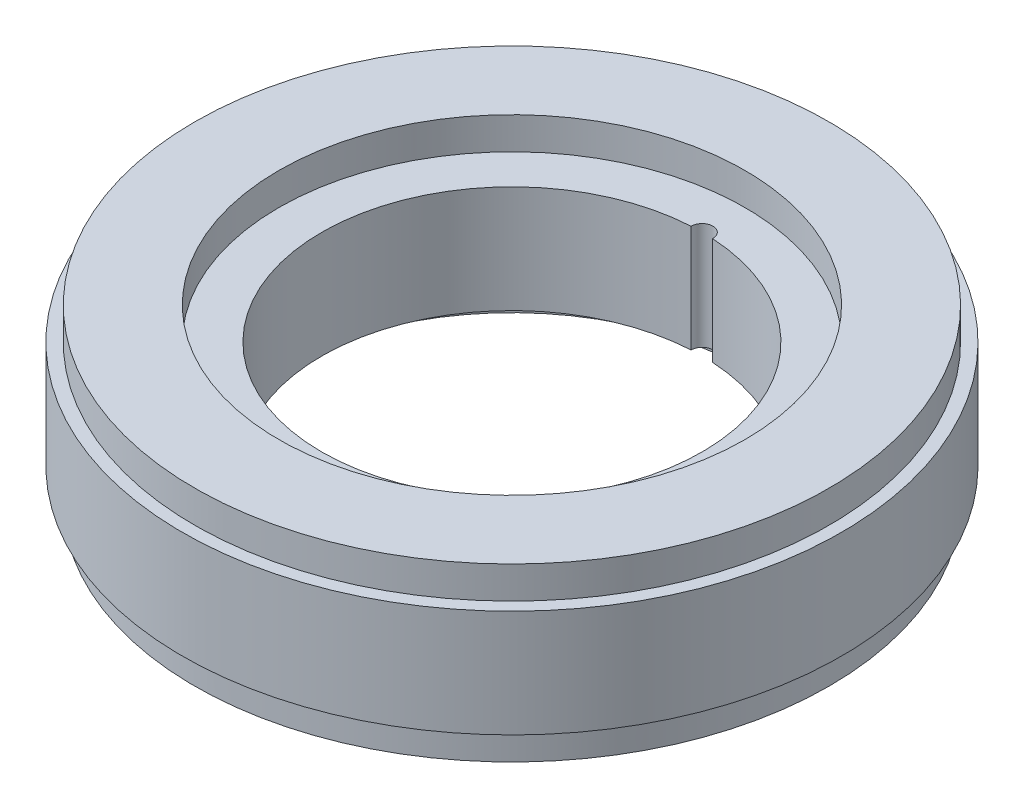
ISO-10303-21;
HEADER;
FILE_DESCRIPTION(('STEP AP214'),'2;1');
FILE_NAME('part.step','',(''),(''),'','','');
FILE_SCHEMA(('AUTOMOTIVE_DESIGN { 1 0 10303 214 1 1 1 1 }'));
ENDSEC;
DATA;
#1=APPLICATION_CONTEXT('core data for automotive mechanical design processes');
#2=APPLICATION_PROTOCOL_DEFINITION('international standard','automotive_design',2000,#1);
#3=PRODUCT_CONTEXT('',#1,'mechanical');
#4=PRODUCT('Part','Part','',(#3));
#5=PRODUCT_RELATED_PRODUCT_CATEGORY('part','',(#4));
#6=PRODUCT_DEFINITION_FORMATION('','',#4);
#7=PRODUCT_DEFINITION_CONTEXT('part definition',#1,'design');
#8=PRODUCT_DEFINITION('design','',#6,#7);
#9=PRODUCT_DEFINITION_SHAPE('','',#8);
#10=(LENGTH_UNIT() NAMED_UNIT(*) SI_UNIT(.MILLI.,.METRE.));
#11=(NAMED_UNIT(*) PLANE_ANGLE_UNIT() SI_UNIT($,.RADIAN.));
#12=(NAMED_UNIT(*) SI_UNIT($,.STERADIAN.) SOLID_ANGLE_UNIT());
#13=UNCERTAINTY_MEASURE_WITH_UNIT(LENGTH_MEASURE(1.E-05),#10,'distance_accuracy_value','');
#14=(GEOMETRIC_REPRESENTATION_CONTEXT(3) GLOBAL_UNCERTAINTY_ASSIGNED_CONTEXT((#13)) GLOBAL_UNIT_ASSIGNED_CONTEXT((#10,
#11,#12)) REPRESENTATION_CONTEXT('',''));
#15=CARTESIAN_POINT('',(0.,0.,0.));
#16=DIRECTION('',(0.,0.,1.));
#17=DIRECTION('',(1.,0.,0.));
#18=AXIS2_PLACEMENT_3D('',#15,#16,#17);
#19=CARTESIAN_POINT('',(0.,0.,-17.75));
#20=DIRECTION('',(0.,-1.,0.));
#21=DIRECTION('',(1.,0.,0.));
#22=AXIS2_PLACEMENT_3D('',#19,#20,#21);
#23=CYLINDRICAL_SURFACE('',#22,1.);
#24=DIRECTION('',(0.,-1.,0.));
#25=VECTOR('',#24,1.);
#26=CARTESIAN_POINT('',(0.9996031745875,10.,-17.72183098592));
#27=LINE('',#26,#25);
#28=CARTESIAN_POINT('',(0.9996031745876,10.,-17.72183098592));
#29=VERTEX_POINT('',#28);
#30=CARTESIAN_POINT('',(0.9996031745876,0.,-17.72183098592));
#31=VERTEX_POINT('',#30);
#32=EDGE_CURVE('E62',#29,#31,#27,.T.);
#33=ORIENTED_EDGE('',*,*,#32,.F.);
#34=CARTESIAN_POINT('',(0.,10.,-17.75));
#35=DIRECTION('',(0.,1.,0.));
#36=DIRECTION('',(-1.,0.,0.));
#37=AXIS2_PLACEMENT_3D('',#34,#35,#36);
#38=CIRCLE('',#37,1.);
#39=CARTESIAN_POINT('',(-0.9996031745876,10.,-17.72183098592));
#40=VERTEX_POINT('',#39);
#41=EDGE_CURVE('E52',#29,#40,#38,.T.);
#42=ORIENTED_EDGE('',*,*,#41,.T.);
#43=DIRECTION('',(0.,-1.,0.));
#44=VECTOR('',#43,1.);
#45=CARTESIAN_POINT('',(-0.9996031745875,10.,-17.72183098592));
#46=LINE('',#45,#44);
#47=CARTESIAN_POINT('',(-0.9996031745876,0.,-17.72183098592));
#48=VERTEX_POINT('',#47);
#49=EDGE_CURVE('E66',#40,#48,#46,.T.);
#50=ORIENTED_EDGE('',*,*,#49,.T.);
#51=CARTESIAN_POINT('',(0.,0.,-17.75));
#52=DIRECTION('',(0.,-1.,0.));
#53=DIRECTION('',(1.,0.,0.));
#54=AXIS2_PLACEMENT_3D('',#51,#52,#53);
#55=CIRCLE('',#54,1.);
#56=EDGE_CURVE('E20',#48,#31,#55,.T.);
#57=ORIENTED_EDGE('',*,*,#56,.T.);
#58=EDGE_LOOP('',(#33,#42,#50,#57));
#59=FACE_BOUND('',#58,.T.);
#60=ADVANCED_FACE('F17',(#59),#23,.F.);
#61=CARTESIAN_POINT('',(0.,0.,0.));
#62=DIRECTION('',(0.,-1.,0.));
#63=DIRECTION('',(1.,0.,0.));
#64=AXIS2_PLACEMENT_3D('',#61,#62,#63);
#65=CYLINDRICAL_SURFACE('',#64,29.6);
#66=CARTESIAN_POINT('',(0.,-3.,0.));
#67=DIRECTION('',(0.,1.,0.));
#68=DIRECTION('',(1.,0.,0.));
#69=AXIS2_PLACEMENT_3D('',#66,#67,#68);
#70=CIRCLE('',#69,29.6);
#71=CARTESIAN_POINT('',(29.6,-3.,0.));
#72=VERTEX_POINT('',#71);
#73=EDGE_CURVE('E11',#72,#72,#70,.T.);
#74=ORIENTED_EDGE('',*,*,#73,.T.);
#75=EDGE_LOOP('',(#74));
#76=FACE_BOUND('',#75,.T.);
#77=CARTESIAN_POINT('',(0.,0.,0.));
#78=DIRECTION('',(0.,-1.,0.));
#79=DIRECTION('',(-1.,0.,0.));
#80=AXIS2_PLACEMENT_3D('',#77,#78,#79);
#81=CIRCLE('',#80,29.6);
#82=CARTESIAN_POINT('',(-29.6,0.,0.));
#83=VERTEX_POINT('',#82);
#84=EDGE_CURVE('E113',#83,#83,#81,.T.);
#85=ORIENTED_EDGE('',*,*,#84,.T.);
#86=EDGE_LOOP('',(#85));
#87=FACE_BOUND('',#86,.T.);
#88=ADVANCED_FACE('F143',(#76,#87),#65,.T.);
#89=CARTESIAN_POINT('',(0.,-3.,0.));
#90=DIRECTION('',(0.,-1.,0.));
#91=DIRECTION('',(0.,0.,-1.));
#92=AXIS2_PLACEMENT_3D('',#89,#90,#91);
#93=PLANE('',#92);
#94=CARTESIAN_POINT('',(0.,-3.,0.));
#95=DIRECTION('',(0.,-1.,0.));
#96=DIRECTION('',(-1.,0.,1.183886126291E-13));
#97=AXIS2_PLACEMENT_3D('',#94,#95,#96);
#98=CIRCLE('',#97,21.75);
#99=CARTESIAN_POINT('',(-21.75,-3.,2.57495232468292E-12));
#100=VERTEX_POINT('',#99);
#101=EDGE_CURVE('E27',#100,#100,#98,.T.);
#102=ORIENTED_EDGE('',*,*,#101,.F.);
#103=EDGE_LOOP('',(#102));
#104=FACE_BOUND('',#103,.T.);
#105=ORIENTED_EDGE('',*,*,#73,.F.);
#106=EDGE_LOOP('',(#105));
#107=FACE_BOUND('',#106,.T.);
#108=ADVANCED_FACE('F147',(#104,#107),#93,.T.);
#109=CARTESIAN_POINT('',(0.,0.,0.));
#110=DIRECTION('',(0.,-1.,0.));
#111=DIRECTION('',(1.,0.,0.));
#112=AXIS2_PLACEMENT_3D('',#109,#110,#111);
#113=CYLINDRICAL_SURFACE('',#112,21.75);
#114=ORIENTED_EDGE('',*,*,#101,.T.);
#115=EDGE_LOOP('',(#114));
#116=FACE_BOUND('',#115,.T.);
#117=CARTESIAN_POINT('',(0.,0.,0.));
#118=DIRECTION('',(0.,1.,0.));
#119=DIRECTION('',(-1.,0.,0.));
#120=AXIS2_PLACEMENT_3D('',#117,#118,#119);
#121=CIRCLE('',#120,21.75);
#122=CARTESIAN_POINT('',(-21.75,0.,0.));
#123=VERTEX_POINT('',#122);
#124=EDGE_CURVE('E79',#123,#123,#121,.T.);
#125=ORIENTED_EDGE('',*,*,#124,.T.);
#126=EDGE_LOOP('',(#125));
#127=FACE_BOUND('',#126,.T.);
#128=ADVANCED_FACE('F152',(#116,#127),#113,.F.);
#129=CARTESIAN_POINT('',(0.,0.,0.));
#130=DIRECTION('',(0.,1.,0.));
#131=DIRECTION('',(1.,0.,0.));
#132=AXIS2_PLACEMENT_3D('',#129,#130,#131);
#133=PLANE('',#132);
#134=ORIENTED_EDGE('',*,*,#56,.F.);
#135=CARTESIAN_POINT('',(0.,0.,0.));
#136=DIRECTION('',(0.,-1.,0.));
#137=DIRECTION('',(0.0563156718077508,0.,-0.998413013291014));
#138=AXIS2_PLACEMENT_3D('',#135,#136,#137);
#139=CIRCLE('',#138,17.75);
#140=EDGE_CURVE('E65',#31,#48,#139,.T.);
#141=ORIENTED_EDGE('',*,*,#140,.F.);
#142=EDGE_LOOP('',(#134,#141));
#143=FACE_BOUND('',#142,.T.);
#144=ORIENTED_EDGE('',*,*,#124,.F.);
#145=EDGE_LOOP('',(#144));
#146=FACE_BOUND('',#145,.T.);
#147=ADVANCED_FACE('F157',(#143,#146),#133,.F.);
#148=CARTESIAN_POINT('',(0.,0.,0.));
#149=DIRECTION('',(0.,-1.,0.));
#150=DIRECTION('',(1.,0.,0.));
#151=AXIS2_PLACEMENT_3D('',#148,#149,#150);
#152=CYLINDRICAL_SURFACE('',#151,17.75);
#153=ORIENTED_EDGE('',*,*,#49,.F.);
#154=CARTESIAN_POINT('',(0.,10.,0.));
#155=DIRECTION('',(0.,1.,0.));
#156=DIRECTION('',(1.,0.,0.));
#157=AXIS2_PLACEMENT_3D('',#154,#155,#156);
#158=CIRCLE('',#157,17.75);
#159=EDGE_CURVE('E56',#40,#29,#158,.T.);
#160=ORIENTED_EDGE('',*,*,#159,.T.);
#161=ORIENTED_EDGE('',*,*,#32,.T.);
#162=ORIENTED_EDGE('',*,*,#140,.T.);
#163=EDGE_LOOP('',(#153,#160,#161,#162));
#164=FACE_BOUND('',#163,.T.);
#165=ADVANCED_FACE('F68',(#164),#152,.F.);
#166=CARTESIAN_POINT('',(0.,10.,0.));
#167=DIRECTION('',(0.,1.,0.));
#168=DIRECTION('',(1.,0.,0.));
#169=AXIS2_PLACEMENT_3D('',#166,#167,#168);
#170=PLANE('',#169);
#171=ORIENTED_EDGE('',*,*,#41,.F.);
#172=ORIENTED_EDGE('',*,*,#159,.F.);
#173=EDGE_LOOP('',(#171,#172));
#174=FACE_BOUND('',#173,.T.);
#175=CARTESIAN_POINT('',(0.,10.,0.));
#176=DIRECTION('',(0.,-1.,0.));
#177=DIRECTION('',(-1.,0.,0.));
#178=AXIS2_PLACEMENT_3D('',#175,#176,#177);
#179=CIRCLE('',#178,21.75);
#180=CARTESIAN_POINT('',(-21.75,10.,0.));
#181=VERTEX_POINT('',#180);
#182=EDGE_CURVE('E59',#181,#181,#179,.T.);
#183=ORIENTED_EDGE('',*,*,#182,.F.);
#184=EDGE_LOOP('',(#183));
#185=FACE_BOUND('',#184,.T.);
#186=ADVANCED_FACE('F53',(#174,#185),#170,.T.);
#187=CARTESIAN_POINT('',(0.,10.,0.));
#188=DIRECTION('',(0.,1.,0.));
#189=DIRECTION('',(1.,0.,0.));
#190=AXIS2_PLACEMENT_3D('',#187,#188,#189);
#191=CYLINDRICAL_SURFACE('',#190,21.75);
#192=ORIENTED_EDGE('',*,*,#182,.T.);
#193=EDGE_LOOP('',(#192));
#194=FACE_BOUND('',#193,.T.);
#195=CARTESIAN_POINT('',(0.,13.,0.));
#196=DIRECTION('',(0.,1.,0.));
#197=DIRECTION('',(-1.,0.,1.174005936248E-13));
#198=AXIS2_PLACEMENT_3D('',#195,#196,#197);
#199=CIRCLE('',#198,21.75);
#200=CARTESIAN_POINT('',(-21.75,13.,2.5534629113394E-12));
#201=VERTEX_POINT('',#200);
#202=EDGE_CURVE('E100',#201,#201,#199,.T.);
#203=ORIENTED_EDGE('',*,*,#202,.T.);
#204=EDGE_LOOP('',(#203));
#205=FACE_BOUND('',#204,.T.);
#206=ADVANCED_FACE('F163',(#194,#205),#191,.F.);
#207=CARTESIAN_POINT('',(0.,13.,0.));
#208=DIRECTION('',(0.,1.,0.));
#209=DIRECTION('',(1.,0.,0.));
#210=AXIS2_PLACEMENT_3D('',#207,#208,#209);
#211=PLANE('',#210);
#212=ORIENTED_EDGE('',*,*,#202,.F.);
#213=EDGE_LOOP('',(#212));
#214=FACE_BOUND('',#213,.T.);
#215=CARTESIAN_POINT('',(0.,13.,0.));
#216=DIRECTION('',(0.,-1.,0.));
#217=DIRECTION('',(-1.,0.,0.));
#218=AXIS2_PLACEMENT_3D('',#215,#216,#217);
#219=CIRCLE('',#218,29.6);
#220=CARTESIAN_POINT('',(-29.6,13.,-1.11256968356758E-12));
#221=VERTEX_POINT('',#220);
#222=EDGE_CURVE('E101',#221,#221,#219,.T.);
#223=ORIENTED_EDGE('',*,*,#222,.F.);
#224=EDGE_LOOP('',(#223));
#225=FACE_BOUND('',#224,.T.);
#226=ADVANCED_FACE('F166',(#214,#225),#211,.T.);
#227=CARTESIAN_POINT('',(0.,10.,0.));
#228=DIRECTION('',(0.,1.,0.));
#229=DIRECTION('',(1.,0.,0.));
#230=AXIS2_PLACEMENT_3D('',#227,#228,#229);
#231=CYLINDRICAL_SURFACE('',#230,29.6);
#232=ORIENTED_EDGE('',*,*,#222,.T.);
#233=EDGE_LOOP('',(#232));
#234=FACE_BOUND('',#233,.T.);
#235=CARTESIAN_POINT('',(0.,10.,0.));
#236=DIRECTION('',(0.,1.,0.));
#237=DIRECTION('',(-1.,0.,0.));
#238=AXIS2_PLACEMENT_3D('',#235,#236,#237);
#239=CIRCLE('',#238,29.6);
#240=CARTESIAN_POINT('',(-29.6,10.,0.));
#241=VERTEX_POINT('',#240);
#242=EDGE_CURVE('E104',#241,#241,#239,.T.);
#243=ORIENTED_EDGE('',*,*,#242,.T.);
#244=EDGE_LOOP('',(#243));
#245=FACE_BOUND('',#244,.T.);
#246=ADVANCED_FACE('F170',(#234,#245),#231,.T.);
#247=CARTESIAN_POINT('',(0.,10.,0.));
#248=DIRECTION('',(0.,1.,0.));
#249=DIRECTION('',(1.,0.,0.));
#250=AXIS2_PLACEMENT_3D('',#247,#248,#249);
#251=PLANE('',#250);
#252=ORIENTED_EDGE('',*,*,#242,.F.);
#253=EDGE_LOOP('',(#252));
#254=FACE_BOUND('',#253,.T.);
#255=CARTESIAN_POINT('',(0.,10.,0.));
#256=DIRECTION('',(0.,-1.,0.));
#257=DIRECTION('',(-1.,0.,0.));
#258=AXIS2_PLACEMENT_3D('',#255,#256,#257);
#259=CIRCLE('',#258,30.75);
#260=CARTESIAN_POINT('',(-30.75,10.,0.));
#261=VERTEX_POINT('',#260);
#262=EDGE_CURVE('E109',#261,#261,#259,.T.);
#263=ORIENTED_EDGE('',*,*,#262,.F.);
#264=EDGE_LOOP('',(#263));
#265=FACE_BOUND('',#264,.T.);
#266=ADVANCED_FACE('F137',(#254,#265),#251,.T.);
#267=CARTESIAN_POINT('',(0.,0.,0.));
#268=DIRECTION('',(0.,1.,0.));
#269=DIRECTION('',(1.,0.,0.));
#270=AXIS2_PLACEMENT_3D('',#267,#268,#269);
#271=CYLINDRICAL_SURFACE('',#270,30.75);
#272=ORIENTED_EDGE('',*,*,#262,.T.);
#273=EDGE_LOOP('',(#272));
#274=FACE_BOUND('',#273,.T.);
#275=CARTESIAN_POINT('',(0.,0.,0.));
#276=DIRECTION('',(0.,1.,0.));
#277=DIRECTION('',(-1.,0.,0.));
#278=AXIS2_PLACEMENT_3D('',#275,#276,#277);
#279=CIRCLE('',#278,30.75);
#280=CARTESIAN_POINT('',(-30.75,0.,0.));
#281=VERTEX_POINT('',#280);
#282=EDGE_CURVE('E117',#281,#281,#279,.T.);
#283=ORIENTED_EDGE('',*,*,#282,.T.);
#284=EDGE_LOOP('',(#283));
#285=FACE_BOUND('',#284,.T.);
#286=ADVANCED_FACE('F127',(#274,#285),#271,.T.);
#287=CARTESIAN_POINT('',(0.,0.,0.));
#288=DIRECTION('',(0.,1.,0.));
#289=DIRECTION('',(1.,0.,0.));
#290=AXIS2_PLACEMENT_3D('',#287,#288,#289);
#291=PLANE('',#290);
#292=ORIENTED_EDGE('',*,*,#84,.F.);
#293=EDGE_LOOP('',(#292));
#294=FACE_BOUND('',#293,.T.);
#295=ORIENTED_EDGE('',*,*,#282,.F.);
#296=EDGE_LOOP('',(#295));
#297=FACE_BOUND('',#296,.T.);
#298=ADVANCED_FACE('F129',(#294,#297),#291,.F.);
#299=CLOSED_SHELL('',(#60,#88,#108,#128,#147,#165,#186,#206,#226,#246,#266,#286,#298));
#300=MANIFOLD_SOLID_BREP('B1',#299);
#301=ADVANCED_BREP_SHAPE_REPRESENTATION('',(#18,#300),#14);
#302=SHAPE_DEFINITION_REPRESENTATION(#9,#301);
ENDSEC;
END-ISO-10303-21;
